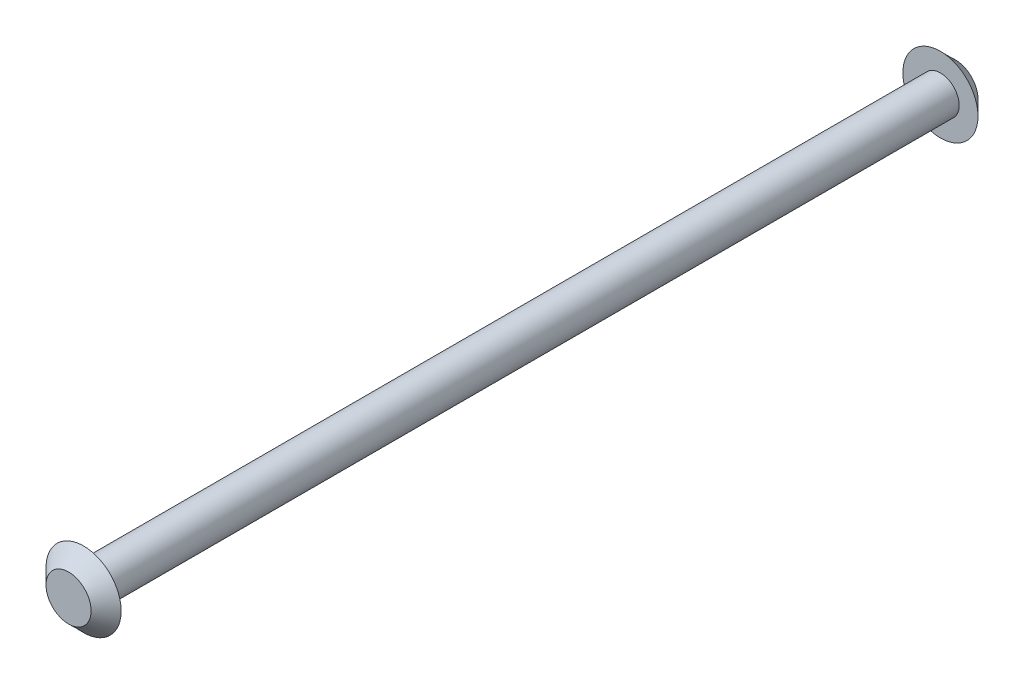
ISO-10303-21;
HEADER;
FILE_DESCRIPTION(('STEP AP214'),'2;1');
FILE_NAME('part.step','',(''),(''),'','','');
FILE_SCHEMA(('AUTOMOTIVE_DESIGN { 1 0 10303 214 1 1 1 1 }'));
ENDSEC;
DATA;
#1=APPLICATION_CONTEXT('core data for automotive mechanical design processes');
#2=APPLICATION_PROTOCOL_DEFINITION('international standard','automotive_design',2000,#1);
#3=PRODUCT_CONTEXT('',#1,'mechanical');
#4=PRODUCT('Part','Part','',(#3));
#5=PRODUCT_RELATED_PRODUCT_CATEGORY('part','',(#4));
#6=PRODUCT_DEFINITION_FORMATION('','',#4);
#7=PRODUCT_DEFINITION_CONTEXT('part definition',#1,'design');
#8=PRODUCT_DEFINITION('design','',#6,#7);
#9=PRODUCT_DEFINITION_SHAPE('','',#8);
#10=(LENGTH_UNIT() NAMED_UNIT(*) SI_UNIT(.MILLI.,.METRE.));
#11=(NAMED_UNIT(*) PLANE_ANGLE_UNIT() SI_UNIT($,.RADIAN.));
#12=(NAMED_UNIT(*) SI_UNIT($,.STERADIAN.) SOLID_ANGLE_UNIT());
#13=UNCERTAINTY_MEASURE_WITH_UNIT(LENGTH_MEASURE(1.E-05),#10,'distance_accuracy_value','');
#14=(GEOMETRIC_REPRESENTATION_CONTEXT(3) GLOBAL_UNCERTAINTY_ASSIGNED_CONTEXT((#13)) GLOBAL_UNIT_ASSIGNED_CONTEXT((#10,
#11,#12)) REPRESENTATION_CONTEXT('',''));
#15=CARTESIAN_POINT('',(0.,0.,0.));
#16=DIRECTION('',(0.,0.,1.));
#17=DIRECTION('',(1.,0.,0.));
#18=AXIS2_PLACEMENT_3D('',#15,#16,#17);
#19=CARTESIAN_POINT('',(0.,0.,144.78));
#20=DIRECTION('',(0.,0.,-1.));
#21=DIRECTION('',(-1.,0.,0.));
#22=AXIS2_PLACEMENT_3D('',#19,#20,#21);
#23=CYLINDRICAL_SURFACE('',#22,3.175);
#24=CARTESIAN_POINT('',(0.,0.,144.78));
#25=DIRECTION('',(0.,0.,1.));
#26=DIRECTION('',(1.,0.,0.));
#27=AXIS2_PLACEMENT_3D('',#24,#25,#26);
#28=CIRCLE('',#27,3.175);
#29=CARTESIAN_POINT('',(3.175,0.,144.78));
#30=VERTEX_POINT('',#29);
#31=EDGE_CURVE('E47',#30,#30,#28,.T.);
#32=ORIENTED_EDGE('',*,*,#31,.F.);
#33=EDGE_LOOP('',(#32));
#34=FACE_BOUND('',#33,.T.);
#35=CARTESIAN_POINT('',(0.,0.,0.));
#36=DIRECTION('',(0.,0.,1.));
#37=DIRECTION('',(1.,0.,0.));
#38=AXIS2_PLACEMENT_3D('',#35,#36,#37);
#39=CIRCLE('',#38,3.175);
#40=CARTESIAN_POINT('',(3.175,0.,0.));
#41=VERTEX_POINT('',#40);
#42=EDGE_CURVE('E54',#41,#41,#39,.T.);
#43=ORIENTED_EDGE('',*,*,#42,.T.);
#44=EDGE_LOOP('',(#43));
#45=FACE_BOUND('',#44,.T.);
#46=ADVANCED_FACE('F35',(#34,#45),#23,.T.);
#47=CARTESIAN_POINT('',(0.,0.,147.32));
#48=DIRECTION('',(0.,0.,1.));
#49=DIRECTION('',(1.,0.,0.));
#50=AXIS2_PLACEMENT_3D('',#47,#48,#49);
#51=PLANE('',#50);
#52=CARTESIAN_POINT('',(0.,0.,147.32));
#53=DIRECTION('',(0.,0.,1.));
#54=DIRECTION('',(1.,0.,0.));
#55=AXIS2_PLACEMENT_3D('',#52,#53,#54);
#56=CIRCLE('',#55,3.81000000000001);
#57=CARTESIAN_POINT('',(3.81000000000001,0.,147.32));
#58=VERTEX_POINT('',#57);
#59=EDGE_CURVE('E43',#58,#58,#56,.T.);
#60=ORIENTED_EDGE('',*,*,#59,.T.);
#61=EDGE_LOOP('',(#60));
#62=FACE_BOUND('',#61,.T.);
#63=ADVANCED_FACE('F74',(#62),#51,.T.);
#64=CARTESIAN_POINT('',(0.,0.,144.78));
#65=DIRECTION('',(0.,0.,1.));
#66=DIRECTION('',(1.,0.,0.));
#67=AXIS2_PLACEMENT_3D('',#64,#65,#66);
#68=PLANE('',#67);
#69=ORIENTED_EDGE('',*,*,#31,.T.);
#70=EDGE_LOOP('',(#69));
#71=FACE_BOUND('',#70,.T.);
#72=CARTESIAN_POINT('',(0.,0.,144.78));
#73=DIRECTION('',(0.,0.,1.));
#74=DIRECTION('',(1.,0.,0.));
#75=AXIS2_PLACEMENT_3D('',#72,#73,#74);
#76=CIRCLE('',#75,6.35);
#77=CARTESIAN_POINT('',(6.35,0.,144.78));
#78=VERTEX_POINT('',#77);
#79=EDGE_CURVE('E51',#78,#78,#76,.T.);
#80=ORIENTED_EDGE('',*,*,#79,.F.);
#81=EDGE_LOOP('',(#80));
#82=FACE_BOUND('',#81,.T.);
#83=ADVANCED_FACE('F80',(#71,#82),#68,.F.);
#84=CARTESIAN_POINT('',(0.,0.,147.32));
#85=DIRECTION('',(0.,0.,-1.));
#86=DIRECTION('',(-1.,0.,0.));
#87=AXIS2_PLACEMENT_3D('',#84,#85,#86);
#88=CONICAL_SURFACE('',#87,3.81000000000001,0.785398163397444);
#89=ORIENTED_EDGE('',*,*,#79,.T.);
#90=EDGE_LOOP('',(#89));
#91=FACE_BOUND('',#90,.T.);
#92=ORIENTED_EDGE('',*,*,#59,.F.);
#93=EDGE_LOOP('',(#92));
#94=FACE_BOUND('',#93,.T.);
#95=ADVANCED_FACE('F86',(#91,#94),#88,.T.);
#96=CARTESIAN_POINT('',(0.,0.,-2.54));
#97=DIRECTION('',(0.,0.,-1.));
#98=DIRECTION('',(1.,0.,0.));
#99=AXIS2_PLACEMENT_3D('',#96,#97,#98);
#100=PLANE('',#99);
#101=CARTESIAN_POINT('',(0.,0.,-2.54));
#102=DIRECTION('',(0.,0.,-1.));
#103=DIRECTION('',(-1.,0.,0.));
#104=AXIS2_PLACEMENT_3D('',#101,#102,#103);
#105=CIRCLE('',#104,3.80999999999998);
#106=CARTESIAN_POINT('',(-3.80999999999998,0.,-2.54));
#107=VERTEX_POINT('',#106);
#108=EDGE_CURVE('E10',#107,#107,#105,.T.);
#109=ORIENTED_EDGE('',*,*,#108,.T.);
#110=EDGE_LOOP('',(#109));
#111=FACE_BOUND('',#110,.T.);
#112=ADVANCED_FACE('F70',(#111),#100,.T.);
#113=CARTESIAN_POINT('',(0.,0.,0.));
#114=DIRECTION('',(0.,0.,-1.));
#115=DIRECTION('',(1.,0.,0.));
#116=AXIS2_PLACEMENT_3D('',#113,#114,#115);
#117=PLANE('',#116);
#118=ORIENTED_EDGE('',*,*,#42,.F.);
#119=EDGE_LOOP('',(#118));
#120=FACE_BOUND('',#119,.T.);
#121=CARTESIAN_POINT('',(0.,0.,0.));
#122=DIRECTION('',(0.,0.,1.));
#123=DIRECTION('',(1.,0.,0.));
#124=AXIS2_PLACEMENT_3D('',#121,#122,#123);
#125=CIRCLE('',#124,6.35);
#126=CARTESIAN_POINT('',(6.35,0.,0.));
#127=VERTEX_POINT('',#126);
#128=EDGE_CURVE('E56',#127,#127,#125,.T.);
#129=ORIENTED_EDGE('',*,*,#128,.T.);
#130=EDGE_LOOP('',(#129));
#131=FACE_BOUND('',#130,.T.);
#132=ADVANCED_FACE('F63',(#120,#131),#117,.F.);
#133=CARTESIAN_POINT('',(0.,0.,0.));
#134=DIRECTION('',(0.,0.,1.));
#135=DIRECTION('',(1.,0.,0.));
#136=AXIS2_PLACEMENT_3D('',#133,#134,#135);
#137=CONICAL_SURFACE('',#136,6.35,0.785398163397443);
#138=ORIENTED_EDGE('',*,*,#108,.F.);
#139=EDGE_LOOP('',(#138));
#140=FACE_BOUND('',#139,.T.);
#141=ORIENTED_EDGE('',*,*,#128,.F.);
#142=EDGE_LOOP('',(#141));
#143=FACE_BOUND('',#142,.T.);
#144=ADVANCED_FACE('F38',(#140,#143),#137,.T.);
#145=CLOSED_SHELL('',(#46,#63,#83,#95,#112,#132,#144));
#146=MANIFOLD_SOLID_BREP('B2',#145);
#147=ADVANCED_BREP_SHAPE_REPRESENTATION('',(#18,#146),#14);
#148=SHAPE_DEFINITION_REPRESENTATION(#9,#147);
ENDSEC;
END-ISO-10303-21;
